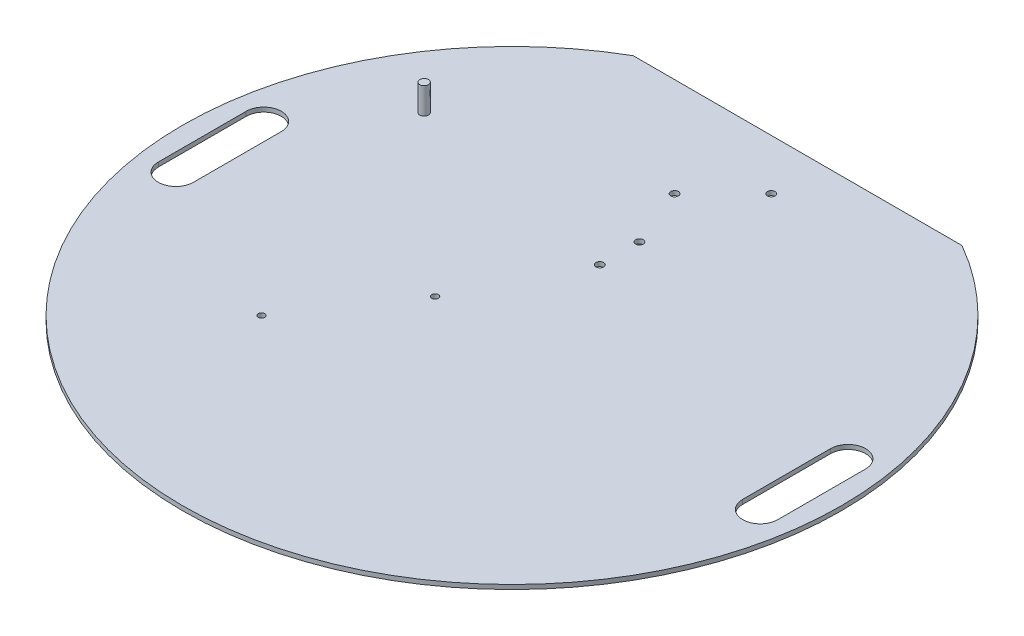
ISO-10303-21;
HEADER;
FILE_DESCRIPTION(('STEP AP214'),'2;1');
FILE_NAME('part.step','',(''),(''),'','','');
FILE_SCHEMA(('AUTOMOTIVE_DESIGN { 1 0 10303 214 1 1 1 1 }'));
ENDSEC;
DATA;
#1=APPLICATION_CONTEXT('core data for automotive mechanical design processes');
#2=APPLICATION_PROTOCOL_DEFINITION('international standard','automotive_design',2000,#1);
#3=PRODUCT_CONTEXT('',#1,'mechanical');
#4=PRODUCT('Part','Part','',(#3));
#5=PRODUCT_RELATED_PRODUCT_CATEGORY('part','',(#4));
#6=PRODUCT_DEFINITION_FORMATION('','',#4);
#7=PRODUCT_DEFINITION_CONTEXT('part definition',#1,'design');
#8=PRODUCT_DEFINITION('design','',#6,#7);
#9=PRODUCT_DEFINITION_SHAPE('','',#8);
#10=(LENGTH_UNIT() NAMED_UNIT(*) SI_UNIT(.MILLI.,.METRE.));
#11=(NAMED_UNIT(*) PLANE_ANGLE_UNIT() SI_UNIT($,.RADIAN.));
#12=(NAMED_UNIT(*) SI_UNIT($,.STERADIAN.) SOLID_ANGLE_UNIT());
#13=UNCERTAINTY_MEASURE_WITH_UNIT(LENGTH_MEASURE(1.E-05),#10,'distance_accuracy_value','');
#14=(GEOMETRIC_REPRESENTATION_CONTEXT(3) GLOBAL_UNCERTAINTY_ASSIGNED_CONTEXT((#13)) GLOBAL_UNIT_ASSIGNED_CONTEXT((#10,
#11,#12)) REPRESENTATION_CONTEXT('',''));
#15=CARTESIAN_POINT('',(0.,0.,0.));
#16=DIRECTION('',(0.,0.,1.));
#17=DIRECTION('',(1.,0.,0.));
#18=AXIS2_PLACEMENT_3D('',#15,#16,#17);
#19=CARTESIAN_POINT('',(0.,2.,0.));
#20=DIRECTION('',(0.,1.,0.));
#21=DIRECTION('',(0.,0.,1.));
#22=AXIS2_PLACEMENT_3D('',#19,#20,#21);
#23=PLANE('',#22);
#24=CARTESIAN_POINT('',(0.,2.,0.));
#25=DIRECTION('',(0.,1.,0.));
#26=DIRECTION('',(0.,0.,1.));
#27=AXIS2_PLACEMENT_3D('',#24,#25,#26);
#28=CIRCLE('',#27,150.);
#29=CARTESIAN_POINT('',(-74.8331477354789,2.,-130.));
#30=VERTEX_POINT('',#29);
#31=CARTESIAN_POINT('',(74.8331477354789,2.,-130.));
#32=VERTEX_POINT('',#31);
#33=EDGE_CURVE('E184',#30,#32,#28,.T.);
#34=ORIENTED_EDGE('',*,*,#33,.T.);
#35=DIRECTION('',(-1.,0.,0.));
#36=VECTOR('',#35,1.);
#37=CARTESIAN_POINT('',(-74.8331477354789,2.,-130.));
#38=LINE('',#37,#36);
#39=EDGE_CURVE('E187',#32,#30,#38,.T.);
#40=ORIENTED_EDGE('',*,*,#39,.T.);
#41=EDGE_LOOP('',(#34,#40));
#42=FACE_BOUND('',#41,.T.);
#43=CARTESIAN_POINT('',(-133.,2.,20.));
#44=DIRECTION('',(0.,-1.,0.));
#45=DIRECTION('',(0.,0.,-1.));
#46=AXIS2_PLACEMENT_3D('',#43,#44,#45);
#47=CIRCLE('',#46,7.99999999999998);
#48=CARTESIAN_POINT('',(-125.,2.,20.));
#49=VERTEX_POINT('',#48);
#50=CARTESIAN_POINT('',(-141.,2.,20.));
#51=VERTEX_POINT('',#50);
#52=EDGE_CURVE('E152',#49,#51,#47,.T.);
#53=ORIENTED_EDGE('',*,*,#52,.T.);
#54=DIRECTION('',(0.,0.,-1.));
#55=VECTOR('',#54,1.);
#56=CARTESIAN_POINT('',(-141.,2.,20.));
#57=LINE('',#56,#55);
#58=CARTESIAN_POINT('',(-141.,2.,-20.));
#59=VERTEX_POINT('',#58);
#60=EDGE_CURVE('E155',#51,#59,#57,.T.);
#61=ORIENTED_EDGE('',*,*,#60,.T.);
#62=CARTESIAN_POINT('',(-133.,2.,-20.));
#63=DIRECTION('',(0.,-1.,0.));
#64=DIRECTION('',(0.,0.,-1.));
#65=AXIS2_PLACEMENT_3D('',#62,#63,#64);
#66=CIRCLE('',#65,7.99999999999998);
#67=CARTESIAN_POINT('',(-125.,2.,-20.));
#68=VERTEX_POINT('',#67);
#69=EDGE_CURVE('E159',#59,#68,#66,.T.);
#70=ORIENTED_EDGE('',*,*,#69,.T.);
#71=DIRECTION('',(0.,0.,1.));
#72=VECTOR('',#71,1.);
#73=CARTESIAN_POINT('',(-125.,2.,20.));
#74=LINE('',#73,#72);
#75=EDGE_CURVE('E162',#68,#49,#74,.T.);
#76=ORIENTED_EDGE('',*,*,#75,.T.);
#77=EDGE_LOOP('',(#53,#61,#70,#76));
#78=FACE_BOUND('',#77,.T.);
#79=CARTESIAN_POINT('',(133.,2.,20.));
#80=DIRECTION('',(0.,-1.,0.));
#81=DIRECTION('',(0.,0.,-1.));
#82=AXIS2_PLACEMENT_3D('',#79,#80,#81);
#83=CIRCLE('',#82,8.00000000000001);
#84=CARTESIAN_POINT('',(141.,2.,20.));
#85=VERTEX_POINT('',#84);
#86=CARTESIAN_POINT('',(125.,2.,20.));
#87=VERTEX_POINT('',#86);
#88=EDGE_CURVE('E114',#85,#87,#83,.T.);
#89=ORIENTED_EDGE('',*,*,#88,.T.);
#90=DIRECTION('',(0.,0.,-1.));
#91=VECTOR('',#90,1.);
#92=CARTESIAN_POINT('',(125.,2.,20.));
#93=LINE('',#92,#91);
#94=CARTESIAN_POINT('',(125.,2.,-20.));
#95=VERTEX_POINT('',#94);
#96=EDGE_CURVE('E123',#87,#95,#93,.T.);
#97=ORIENTED_EDGE('',*,*,#96,.T.);
#98=CARTESIAN_POINT('',(133.,2.,-20.));
#99=DIRECTION('',(0.,-1.,0.));
#100=DIRECTION('',(0.,0.,-1.));
#101=AXIS2_PLACEMENT_3D('',#98,#99,#100);
#102=CIRCLE('',#101,8.00000000000001);
#103=CARTESIAN_POINT('',(141.,2.,-20.));
#104=VERTEX_POINT('',#103);
#105=EDGE_CURVE('E50',#95,#104,#102,.T.);
#106=ORIENTED_EDGE('',*,*,#105,.T.);
#107=DIRECTION('',(0.,0.,1.));
#108=VECTOR('',#107,1.);
#109=CARTESIAN_POINT('',(141.,2.,20.));
#110=LINE('',#109,#108);
#111=EDGE_CURVE('E120',#104,#85,#110,.T.);
#112=ORIENTED_EDGE('',*,*,#111,.T.);
#113=EDGE_LOOP('',(#89,#97,#106,#112));
#114=FACE_BOUND('',#113,.T.);
#115=CARTESIAN_POINT('',(-25.,2.,10.));
#116=DIRECTION('',(0.,-1.,0.));
#117=DIRECTION('',(0.,0.,-1.));
#118=AXIS2_PLACEMENT_3D('',#115,#116,#117);
#119=CIRCLE('',#118,1.50000000000001);
#120=CARTESIAN_POINT('',(-25.,2.,8.49999999999999));
#121=VERTEX_POINT('',#120);
#122=EDGE_CURVE('E142',#121,#121,#119,.T.);
#123=ORIENTED_EDGE('',*,*,#122,.T.);
#124=EDGE_LOOP('',(#123));
#125=FACE_BOUND('',#124,.T.);
#126=CARTESIAN_POINT('',(-57.,2.,57.));
#127=DIRECTION('',(0.,-1.,0.));
#128=DIRECTION('',(0.,0.,-1.));
#129=AXIS2_PLACEMENT_3D('',#126,#127,#128);
#130=CIRCLE('',#129,1.5);
#131=CARTESIAN_POINT('',(-57.,2.,55.5));
#132=VERTEX_POINT('',#131);
#133=EDGE_CURVE('E317',#132,#132,#130,.T.);
#134=ORIENTED_EDGE('',*,*,#133,.T.);
#135=EDGE_LOOP('',(#134));
#136=FACE_BOUND('',#135,.T.);
#137=CARTESIAN_POINT('',(0.,2.,-40.));
#138=DIRECTION('',(0.,-1.,0.));
#139=DIRECTION('',(0.,0.,-1.));
#140=AXIS2_PLACEMENT_3D('',#137,#138,#139);
#141=CIRCLE('',#140,1.75);
#142=CARTESIAN_POINT('',(0.,2.,-41.75));
#143=VERTEX_POINT('',#142);
#144=EDGE_CURVE('E311',#143,#143,#141,.T.);
#145=ORIENTED_EDGE('',*,*,#144,.T.);
#146=EDGE_LOOP('',(#145));
#147=FACE_BOUND('',#146,.T.);
#148=CARTESIAN_POINT('',(0.,2.,-58.));
#149=DIRECTION('',(0.,-1.,0.));
#150=DIRECTION('',(0.,0.,-1.));
#151=AXIS2_PLACEMENT_3D('',#148,#149,#150);
#152=CIRCLE('',#151,1.75);
#153=CARTESIAN_POINT('',(0.,2.,-59.75));
#154=VERTEX_POINT('',#153);
#155=EDGE_CURVE('E305',#154,#154,#152,.T.);
#156=ORIENTED_EDGE('',*,*,#155,.T.);
#157=EDGE_LOOP('',(#156));
#158=FACE_BOUND('',#157,.T.);
#159=CARTESIAN_POINT('',(11.,2.,-107.));
#160=DIRECTION('',(0.,-1.,0.));
#161=DIRECTION('',(0.,0.,-1.));
#162=AXIS2_PLACEMENT_3D('',#159,#160,#161);
#163=CIRCLE('',#162,1.75);
#164=CARTESIAN_POINT('',(11.,2.,-108.75));
#165=VERTEX_POINT('',#164);
#166=EDGE_CURVE('E299',#165,#165,#163,.T.);
#167=ORIENTED_EDGE('',*,*,#166,.T.);
#168=EDGE_LOOP('',(#167));
#169=FACE_BOUND('',#168,.T.);
#170=CARTESIAN_POINT('',(-11.,2.,-85.));
#171=DIRECTION('',(0.,-1.,0.));
#172=DIRECTION('',(0.,0.,-1.));
#173=AXIS2_PLACEMENT_3D('',#170,#171,#172);
#174=CIRCLE('',#173,1.75);
#175=CARTESIAN_POINT('',(-11.,2.,-86.75));
#176=VERTEX_POINT('',#175);
#177=EDGE_CURVE('E291',#176,#176,#174,.T.);
#178=ORIENTED_EDGE('',*,*,#177,.T.);
#179=EDGE_LOOP('',(#178));
#180=FACE_BOUND('',#179,.T.);
#181=CARTESIAN_POINT('',(-100.,2.,-60.));
#182=DIRECTION('',(0.,1.,0.));
#183=DIRECTION('',(0.,0.,1.));
#184=AXIS2_PLACEMENT_3D('',#181,#182,#183);
#185=CIRCLE('',#184,2.);
#186=CARTESIAN_POINT('',(-100.,2.,-58.));
#187=VERTEX_POINT('',#186);
#188=EDGE_CURVE('E288',#187,#187,#185,.T.);
#189=ORIENTED_EDGE('',*,*,#188,.F.);
#190=EDGE_LOOP('',(#189));
#191=FACE_BOUND('',#190,.T.);
#192=ADVANCED_FACE('F35',(#42,#78,#114,#125,#136,#147,#158,#169,#180,#191),#23,.T.);
#193=CARTESIAN_POINT('',(0.,2.,0.));
#194=DIRECTION('',(0.,-1.,0.));
#195=DIRECTION('',(0.,0.,-1.));
#196=AXIS2_PLACEMENT_3D('',#193,#194,#195);
#197=CYLINDRICAL_SURFACE('',#196,150.);
#198=CARTESIAN_POINT('',(0.,0.,0.));
#199=DIRECTION('',(0.,1.,0.));
#200=DIRECTION('',(0.,0.,1.));
#201=AXIS2_PLACEMENT_3D('',#198,#199,#200);
#202=CIRCLE('',#201,150.);
#203=CARTESIAN_POINT('',(-74.8331477354789,0.,-130.));
#204=VERTEX_POINT('',#203);
#205=CARTESIAN_POINT('',(74.8331477354789,0.,-130.));
#206=VERTEX_POINT('',#205);
#207=EDGE_CURVE('E177',#204,#206,#202,.T.);
#208=ORIENTED_EDGE('',*,*,#207,.T.);
#209=DIRECTION('',(0.,-1.,0.));
#210=VECTOR('',#209,1.);
#211=CARTESIAN_POINT('',(74.8331477354789,2.,-130.));
#212=LINE('',#211,#210);
#213=EDGE_CURVE('E11',#32,#206,#212,.T.);
#214=ORIENTED_EDGE('',*,*,#213,.F.);
#215=ORIENTED_EDGE('',*,*,#33,.F.);
#216=DIRECTION('',(0.,-1.,0.));
#217=VECTOR('',#216,1.);
#218=CARTESIAN_POINT('',(-74.8331477354789,2.,-130.));
#219=LINE('',#218,#217);
#220=EDGE_CURVE('E43',#30,#204,#219,.T.);
#221=ORIENTED_EDGE('',*,*,#220,.T.);
#222=EDGE_LOOP('',(#208,#214,#215,#221));
#223=FACE_BOUND('',#222,.T.);
#224=ADVANCED_FACE('F37',(#223),#197,.T.);
#225=CARTESIAN_POINT('',(-74.8331477354789,2.,-130.));
#226=DIRECTION('',(0.,0.,1.));
#227=DIRECTION('',(1.,0.,0.));
#228=AXIS2_PLACEMENT_3D('',#225,#226,#227);
#229=PLANE('',#228);
#230=DIRECTION('',(-1.,0.,0.));
#231=VECTOR('',#230,1.);
#232=CARTESIAN_POINT('',(-74.8331477354789,0.,-130.));
#233=LINE('',#232,#231);
#234=EDGE_CURVE('E188',#206,#204,#233,.T.);
#235=ORIENTED_EDGE('',*,*,#234,.T.);
#236=ORIENTED_EDGE('',*,*,#220,.F.);
#237=ORIENTED_EDGE('',*,*,#39,.F.);
#238=ORIENTED_EDGE('',*,*,#213,.T.);
#239=EDGE_LOOP('',(#235,#236,#237,#238));
#240=FACE_BOUND('',#239,.T.);
#241=ADVANCED_FACE('F201',(#240),#229,.F.);
#242=CARTESIAN_POINT('',(0.,0.,0.));
#243=DIRECTION('',(0.,1.,0.));
#244=DIRECTION('',(0.,0.,1.));
#245=AXIS2_PLACEMENT_3D('',#242,#243,#244);
#246=PLANE('',#245);
#247=CARTESIAN_POINT('',(-11.,0.,-85.));
#248=DIRECTION('',(0.,-1.,0.));
#249=DIRECTION('',(0.,0.,-1.));
#250=AXIS2_PLACEMENT_3D('',#247,#248,#249);
#251=CIRCLE('',#250,1.75);
#252=CARTESIAN_POINT('',(-11.,0.,-86.75));
#253=VERTEX_POINT('',#252);
#254=EDGE_CURVE('E287',#253,#253,#251,.T.);
#255=ORIENTED_EDGE('',*,*,#254,.F.);
#256=EDGE_LOOP('',(#255));
#257=FACE_BOUND('',#256,.T.);
#258=CARTESIAN_POINT('',(11.,0.,-107.));
#259=DIRECTION('',(0.,-1.,0.));
#260=DIRECTION('',(0.,0.,-1.));
#261=AXIS2_PLACEMENT_3D('',#258,#259,#260);
#262=CIRCLE('',#261,1.75);
#263=CARTESIAN_POINT('',(11.,0.,-108.75));
#264=VERTEX_POINT('',#263);
#265=EDGE_CURVE('E297',#264,#264,#262,.T.);
#266=ORIENTED_EDGE('',*,*,#265,.F.);
#267=EDGE_LOOP('',(#266));
#268=FACE_BOUND('',#267,.T.);
#269=CARTESIAN_POINT('',(0.,0.,-58.));
#270=DIRECTION('',(0.,-1.,0.));
#271=DIRECTION('',(0.,0.,-1.));
#272=AXIS2_PLACEMENT_3D('',#269,#270,#271);
#273=CIRCLE('',#272,1.75);
#274=CARTESIAN_POINT('',(0.,0.,-59.75));
#275=VERTEX_POINT('',#274);
#276=EDGE_CURVE('E302',#275,#275,#273,.T.);
#277=ORIENTED_EDGE('',*,*,#276,.F.);
#278=EDGE_LOOP('',(#277));
#279=FACE_BOUND('',#278,.T.);
#280=CARTESIAN_POINT('',(0.,0.,-40.));
#281=DIRECTION('',(0.,-1.,0.));
#282=DIRECTION('',(0.,0.,-1.));
#283=AXIS2_PLACEMENT_3D('',#280,#281,#282);
#284=CIRCLE('',#283,1.75);
#285=CARTESIAN_POINT('',(0.,0.,-41.75));
#286=VERTEX_POINT('',#285);
#287=EDGE_CURVE('E308',#286,#286,#284,.T.);
#288=ORIENTED_EDGE('',*,*,#287,.F.);
#289=EDGE_LOOP('',(#288));
#290=FACE_BOUND('',#289,.T.);
#291=CARTESIAN_POINT('',(-57.,0.,57.));
#292=DIRECTION('',(0.,-1.,0.));
#293=DIRECTION('',(0.,0.,-1.));
#294=AXIS2_PLACEMENT_3D('',#291,#292,#293);
#295=CIRCLE('',#294,1.5);
#296=CARTESIAN_POINT('',(-57.,0.,55.5));
#297=VERTEX_POINT('',#296);
#298=EDGE_CURVE('E314',#297,#297,#295,.T.);
#299=ORIENTED_EDGE('',*,*,#298,.F.);
#300=EDGE_LOOP('',(#299));
#301=FACE_BOUND('',#300,.T.);
#302=CARTESIAN_POINT('',(-25.,0.,10.));
#303=DIRECTION('',(0.,-1.,0.));
#304=DIRECTION('',(0.,0.,-1.));
#305=AXIS2_PLACEMENT_3D('',#302,#303,#304);
#306=CIRCLE('',#305,1.50000000000001);
#307=CARTESIAN_POINT('',(-25.,0.,8.49999999999999));
#308=VERTEX_POINT('',#307);
#309=EDGE_CURVE('E135',#308,#308,#306,.T.);
#310=ORIENTED_EDGE('',*,*,#309,.F.);
#311=EDGE_LOOP('',(#310));
#312=FACE_BOUND('',#311,.T.);
#313=DIRECTION('',(0.,0.,-1.));
#314=VECTOR('',#313,1.);
#315=CARTESIAN_POINT('',(125.,0.,20.));
#316=LINE('',#315,#314);
#317=CARTESIAN_POINT('',(125.,0.,20.));
#318=VERTEX_POINT('',#317);
#319=CARTESIAN_POINT('',(125.,0.,-20.));
#320=VERTEX_POINT('',#319);
#321=EDGE_CURVE('E141',#318,#320,#316,.T.);
#322=ORIENTED_EDGE('',*,*,#321,.F.);
#323=CARTESIAN_POINT('',(133.,0.,20.));
#324=DIRECTION('',(0.,-1.,0.));
#325=DIRECTION('',(0.,0.,-1.));
#326=AXIS2_PLACEMENT_3D('',#323,#324,#325);
#327=CIRCLE('',#326,8.00000000000001);
#328=CARTESIAN_POINT('',(141.,0.,20.));
#329=VERTEX_POINT('',#328);
#330=EDGE_CURVE('E58',#329,#318,#327,.T.);
#331=ORIENTED_EDGE('',*,*,#330,.F.);
#332=DIRECTION('',(0.,0.,1.));
#333=VECTOR('',#332,1.);
#334=CARTESIAN_POINT('',(141.,0.,20.));
#335=LINE('',#334,#333);
#336=CARTESIAN_POINT('',(141.,0.,-20.));
#337=VERTEX_POINT('',#336);
#338=EDGE_CURVE('E129',#337,#329,#335,.T.);
#339=ORIENTED_EDGE('',*,*,#338,.F.);
#340=CARTESIAN_POINT('',(133.,0.,-20.));
#341=DIRECTION('',(0.,-1.,0.));
#342=DIRECTION('',(0.,0.,-1.));
#343=AXIS2_PLACEMENT_3D('',#340,#341,#342);
#344=CIRCLE('',#343,8.00000000000001);
#345=EDGE_CURVE('E132',#320,#337,#344,.T.);
#346=ORIENTED_EDGE('',*,*,#345,.F.);
#347=EDGE_LOOP('',(#322,#331,#339,#346));
#348=FACE_BOUND('',#347,.T.);
#349=DIRECTION('',(0.,0.,-1.));
#350=VECTOR('',#349,1.);
#351=CARTESIAN_POINT('',(-141.,0.,20.));
#352=LINE('',#351,#350);
#353=CARTESIAN_POINT('',(-141.,0.,20.));
#354=VERTEX_POINT('',#353);
#355=CARTESIAN_POINT('',(-141.,0.,-20.));
#356=VERTEX_POINT('',#355);
#357=EDGE_CURVE('E167',#354,#356,#352,.T.);
#358=ORIENTED_EDGE('',*,*,#357,.F.);
#359=CARTESIAN_POINT('',(-133.,0.,20.));
#360=DIRECTION('',(0.,-1.,0.));
#361=DIRECTION('',(0.,0.,-1.));
#362=AXIS2_PLACEMENT_3D('',#359,#360,#361);
#363=CIRCLE('',#362,7.99999999999998);
#364=CARTESIAN_POINT('',(-125.,0.,20.));
#365=VERTEX_POINT('',#364);
#366=EDGE_CURVE('E148',#365,#354,#363,.T.);
#367=ORIENTED_EDGE('',*,*,#366,.F.);
#368=DIRECTION('',(0.,0.,1.));
#369=VECTOR('',#368,1.);
#370=CARTESIAN_POINT('',(-125.,0.,20.));
#371=LINE('',#370,#369);
#372=CARTESIAN_POINT('',(-125.,0.,-20.));
#373=VERTEX_POINT('',#372);
#374=EDGE_CURVE('E156',#373,#365,#371,.T.);
#375=ORIENTED_EDGE('',*,*,#374,.F.);
#376=CARTESIAN_POINT('',(-133.,0.,-20.));
#377=DIRECTION('',(0.,-1.,0.));
#378=DIRECTION('',(0.,0.,-1.));
#379=AXIS2_PLACEMENT_3D('',#376,#377,#378);
#380=CIRCLE('',#379,7.99999999999998);
#381=EDGE_CURVE('E170',#356,#373,#380,.T.);
#382=ORIENTED_EDGE('',*,*,#381,.F.);
#383=EDGE_LOOP('',(#358,#367,#375,#382));
#384=FACE_BOUND('',#383,.T.);
#385=ORIENTED_EDGE('',*,*,#207,.F.);
#386=ORIENTED_EDGE('',*,*,#234,.F.);
#387=EDGE_LOOP('',(#385,#386));
#388=FACE_BOUND('',#387,.T.);
#389=ADVANCED_FACE('F200',(#257,#268,#279,#290,#301,#312,#348,#384,#388),#246,.F.);
#390=CARTESIAN_POINT('',(-133.,2.,20.));
#391=DIRECTION('',(0.,-1.,0.));
#392=DIRECTION('',(0.,0.,-1.));
#393=AXIS2_PLACEMENT_3D('',#390,#391,#392);
#394=CYLINDRICAL_SURFACE('',#393,7.99999999999998);
#395=ORIENTED_EDGE('',*,*,#366,.T.);
#396=DIRECTION('',(0.,-1.,0.));
#397=VECTOR('',#396,1.);
#398=CARTESIAN_POINT('',(-141.,2.,20.));
#399=LINE('',#398,#397);
#400=EDGE_CURVE('E165',#51,#354,#399,.T.);
#401=ORIENTED_EDGE('',*,*,#400,.F.);
#402=ORIENTED_EDGE('',*,*,#52,.F.);
#403=DIRECTION('',(0.,-1.,0.));
#404=VECTOR('',#403,1.);
#405=CARTESIAN_POINT('',(-125.,2.,20.));
#406=LINE('',#405,#404);
#407=EDGE_CURVE('E175',#49,#365,#406,.T.);
#408=ORIENTED_EDGE('',*,*,#407,.T.);
#409=EDGE_LOOP('',(#395,#401,#402,#408));
#410=FACE_BOUND('',#409,.T.);
#411=ADVANCED_FACE('F210',(#410),#394,.F.);
#412=CARTESIAN_POINT('',(-125.,2.,20.));
#413=DIRECTION('',(1.,0.,0.));
#414=DIRECTION('',(0.,0.,-1.));
#415=AXIS2_PLACEMENT_3D('',#412,#413,#414);
#416=PLANE('',#415);
#417=ORIENTED_EDGE('',*,*,#374,.T.);
#418=ORIENTED_EDGE('',*,*,#407,.F.);
#419=ORIENTED_EDGE('',*,*,#75,.F.);
#420=DIRECTION('',(0.,-1.,0.));
#421=VECTOR('',#420,1.);
#422=CARTESIAN_POINT('',(-125.,2.,-20.));
#423=LINE('',#422,#421);
#424=EDGE_CURVE('E178',#68,#373,#423,.T.);
#425=ORIENTED_EDGE('',*,*,#424,.T.);
#426=EDGE_LOOP('',(#417,#418,#419,#425));
#427=FACE_BOUND('',#426,.T.);
#428=ADVANCED_FACE('F221',(#427),#416,.F.);
#429=CARTESIAN_POINT('',(-133.,2.,-20.));
#430=DIRECTION('',(0.,-1.,0.));
#431=DIRECTION('',(0.,0.,-1.));
#432=AXIS2_PLACEMENT_3D('',#429,#430,#431);
#433=CYLINDRICAL_SURFACE('',#432,7.99999999999998);
#434=ORIENTED_EDGE('',*,*,#381,.T.);
#435=ORIENTED_EDGE('',*,*,#424,.F.);
#436=ORIENTED_EDGE('',*,*,#69,.F.);
#437=DIRECTION('',(0.,-1.,0.));
#438=VECTOR('',#437,1.);
#439=CARTESIAN_POINT('',(-141.,2.,-20.));
#440=LINE('',#439,#438);
#441=EDGE_CURVE('E180',#59,#356,#440,.T.);
#442=ORIENTED_EDGE('',*,*,#441,.T.);
#443=EDGE_LOOP('',(#434,#435,#436,#442));
#444=FACE_BOUND('',#443,.T.);
#445=ADVANCED_FACE('F218',(#444),#433,.F.);
#446=CARTESIAN_POINT('',(-141.,2.,20.));
#447=DIRECTION('',(-1.,0.,0.));
#448=DIRECTION('',(0.,0.,1.));
#449=AXIS2_PLACEMENT_3D('',#446,#447,#448);
#450=PLANE('',#449);
#451=ORIENTED_EDGE('',*,*,#357,.T.);
#452=ORIENTED_EDGE('',*,*,#441,.F.);
#453=ORIENTED_EDGE('',*,*,#60,.F.);
#454=ORIENTED_EDGE('',*,*,#400,.T.);
#455=EDGE_LOOP('',(#451,#452,#453,#454));
#456=FACE_BOUND('',#455,.T.);
#457=ADVANCED_FACE('F215',(#456),#450,.F.);
#458=CARTESIAN_POINT('',(133.,2.,20.));
#459=DIRECTION('',(0.,-1.,0.));
#460=DIRECTION('',(0.,0.,-1.));
#461=AXIS2_PLACEMENT_3D('',#458,#459,#460);
#462=CYLINDRICAL_SURFACE('',#461,8.00000000000001);
#463=ORIENTED_EDGE('',*,*,#330,.T.);
#464=DIRECTION('',(0.,-1.,0.));
#465=VECTOR('',#464,1.);
#466=CARTESIAN_POINT('',(125.,2.,20.));
#467=LINE('',#466,#465);
#468=EDGE_CURVE('E110',#87,#318,#467,.T.);
#469=ORIENTED_EDGE('',*,*,#468,.F.);
#470=ORIENTED_EDGE('',*,*,#88,.F.);
#471=DIRECTION('',(0.,-1.,0.));
#472=VECTOR('',#471,1.);
#473=CARTESIAN_POINT('',(141.,2.,20.));
#474=LINE('',#473,#472);
#475=EDGE_CURVE('E146',#85,#329,#474,.T.);
#476=ORIENTED_EDGE('',*,*,#475,.T.);
#477=EDGE_LOOP('',(#463,#469,#470,#476));
#478=FACE_BOUND('',#477,.T.);
#479=ADVANCED_FACE('F112',(#478),#462,.F.);
#480=CARTESIAN_POINT('',(141.,2.,20.));
#481=DIRECTION('',(1.,0.,0.));
#482=DIRECTION('',(0.,0.,-1.));
#483=AXIS2_PLACEMENT_3D('',#480,#481,#482);
#484=PLANE('',#483);
#485=ORIENTED_EDGE('',*,*,#338,.T.);
#486=ORIENTED_EDGE('',*,*,#475,.F.);
#487=ORIENTED_EDGE('',*,*,#111,.F.);
#488=DIRECTION('',(0.,-1.,0.));
#489=VECTOR('',#488,1.);
#490=CARTESIAN_POINT('',(141.,2.,-20.));
#491=LINE('',#490,#489);
#492=EDGE_CURVE('E149',#104,#337,#491,.T.);
#493=ORIENTED_EDGE('',*,*,#492,.T.);
#494=EDGE_LOOP('',(#485,#486,#487,#493));
#495=FACE_BOUND('',#494,.T.);
#496=ADVANCED_FACE('F242',(#495),#484,.F.);
#497=CARTESIAN_POINT('',(133.,2.,-20.));
#498=DIRECTION('',(0.,-1.,0.));
#499=DIRECTION('',(0.,0.,-1.));
#500=AXIS2_PLACEMENT_3D('',#497,#498,#499);
#501=CYLINDRICAL_SURFACE('',#500,8.00000000000001);
#502=ORIENTED_EDGE('',*,*,#345,.T.);
#503=ORIENTED_EDGE('',*,*,#492,.F.);
#504=ORIENTED_EDGE('',*,*,#105,.F.);
#505=DIRECTION('',(0.,-1.,0.));
#506=VECTOR('',#505,1.);
#507=CARTESIAN_POINT('',(125.,2.,-20.));
#508=LINE('',#507,#506);
#509=EDGE_CURVE('E119',#95,#320,#508,.T.);
#510=ORIENTED_EDGE('',*,*,#509,.T.);
#511=EDGE_LOOP('',(#502,#503,#504,#510));
#512=FACE_BOUND('',#511,.T.);
#513=ADVANCED_FACE('F246',(#512),#501,.F.);
#514=CARTESIAN_POINT('',(125.,2.,20.));
#515=DIRECTION('',(-1.,0.,0.));
#516=DIRECTION('',(0.,0.,1.));
#517=AXIS2_PLACEMENT_3D('',#514,#515,#516);
#518=PLANE('',#517);
#519=ORIENTED_EDGE('',*,*,#321,.T.);
#520=ORIENTED_EDGE('',*,*,#509,.F.);
#521=ORIENTED_EDGE('',*,*,#96,.F.);
#522=ORIENTED_EDGE('',*,*,#468,.T.);
#523=EDGE_LOOP('',(#519,#520,#521,#522));
#524=FACE_BOUND('',#523,.T.);
#525=ADVANCED_FACE('F124',(#524),#518,.F.);
#526=CARTESIAN_POINT('',(-25.,2.,10.));
#527=DIRECTION('',(0.,-1.,0.));
#528=DIRECTION('',(0.,0.,-1.));
#529=AXIS2_PLACEMENT_3D('',#526,#527,#528);
#530=CYLINDRICAL_SURFACE('',#529,1.50000000000001);
#531=ORIENTED_EDGE('',*,*,#122,.F.);
#532=EDGE_LOOP('',(#531));
#533=FACE_BOUND('',#532,.T.);
#534=ORIENTED_EDGE('',*,*,#309,.T.);
#535=EDGE_LOOP('',(#534));
#536=FACE_BOUND('',#535,.T.);
#537=ADVANCED_FACE('F245',(#533,#536),#530,.F.);
#538=CARTESIAN_POINT('',(-57.,2.,57.));
#539=DIRECTION('',(0.,-1.,0.));
#540=DIRECTION('',(0.,0.,-1.));
#541=AXIS2_PLACEMENT_3D('',#538,#539,#540);
#542=CYLINDRICAL_SURFACE('',#541,1.5);
#543=ORIENTED_EDGE('',*,*,#133,.F.);
#544=EDGE_LOOP('',(#543));
#545=FACE_BOUND('',#544,.T.);
#546=ORIENTED_EDGE('',*,*,#298,.T.);
#547=EDGE_LOOP('',(#546));
#548=FACE_BOUND('',#547,.T.);
#549=ADVANCED_FACE('F254',(#545,#548),#542,.F.);
#550=CARTESIAN_POINT('',(0.,2.,-40.));
#551=DIRECTION('',(0.,-1.,0.));
#552=DIRECTION('',(0.,0.,-1.));
#553=AXIS2_PLACEMENT_3D('',#550,#551,#552);
#554=CYLINDRICAL_SURFACE('',#553,1.75);
#555=ORIENTED_EDGE('',*,*,#144,.F.);
#556=EDGE_LOOP('',(#555));
#557=FACE_BOUND('',#556,.T.);
#558=ORIENTED_EDGE('',*,*,#287,.T.);
#559=EDGE_LOOP('',(#558));
#560=FACE_BOUND('',#559,.T.);
#561=ADVANCED_FACE('F258',(#557,#560),#554,.F.);
#562=CARTESIAN_POINT('',(0.,2.,-58.));
#563=DIRECTION('',(0.,-1.,0.));
#564=DIRECTION('',(0.,0.,-1.));
#565=AXIS2_PLACEMENT_3D('',#562,#563,#564);
#566=CYLINDRICAL_SURFACE('',#565,1.75);
#567=ORIENTED_EDGE('',*,*,#155,.F.);
#568=EDGE_LOOP('',(#567));
#569=FACE_BOUND('',#568,.T.);
#570=ORIENTED_EDGE('',*,*,#276,.T.);
#571=EDGE_LOOP('',(#570));
#572=FACE_BOUND('',#571,.T.);
#573=ADVANCED_FACE('F262',(#569,#572),#566,.F.);
#574=CARTESIAN_POINT('',(11.,2.,-107.));
#575=DIRECTION('',(0.,-1.,0.));
#576=DIRECTION('',(0.,0.,-1.));
#577=AXIS2_PLACEMENT_3D('',#574,#575,#576);
#578=CYLINDRICAL_SURFACE('',#577,1.75);
#579=ORIENTED_EDGE('',*,*,#166,.F.);
#580=EDGE_LOOP('',(#579));
#581=FACE_BOUND('',#580,.T.);
#582=ORIENTED_EDGE('',*,*,#265,.T.);
#583=EDGE_LOOP('',(#582));
#584=FACE_BOUND('',#583,.T.);
#585=ADVANCED_FACE('F266',(#581,#584),#578,.F.);
#586=CARTESIAN_POINT('',(-11.,2.,-85.));
#587=DIRECTION('',(0.,-1.,0.));
#588=DIRECTION('',(0.,0.,-1.));
#589=AXIS2_PLACEMENT_3D('',#586,#587,#588);
#590=CYLINDRICAL_SURFACE('',#589,1.75);
#591=ORIENTED_EDGE('',*,*,#177,.F.);
#592=EDGE_LOOP('',(#591));
#593=FACE_BOUND('',#592,.T.);
#594=ORIENTED_EDGE('',*,*,#254,.T.);
#595=EDGE_LOOP('',(#594));
#596=FACE_BOUND('',#595,.T.);
#597=ADVANCED_FACE('F270',(#593,#596),#590,.F.);
#598=CARTESIAN_POINT('',(-100.,14.,-60.));
#599=DIRECTION('',(0.,-1.,0.));
#600=DIRECTION('',(0.,0.,-1.));
#601=AXIS2_PLACEMENT_3D('',#598,#599,#600);
#602=CYLINDRICAL_SURFACE('',#601,2.);
#603=CARTESIAN_POINT('',(-100.,14.,-60.));
#604=DIRECTION('',(0.,1.,0.));
#605=DIRECTION('',(0.,0.,1.));
#606=AXIS2_PLACEMENT_3D('',#603,#604,#605);
#607=CIRCLE('',#606,2.);
#608=CARTESIAN_POINT('',(-100.,14.,-58.));
#609=VERTEX_POINT('',#608);
#610=EDGE_CURVE('E286',#609,#609,#607,.T.);
#611=ORIENTED_EDGE('',*,*,#610,.F.);
#612=EDGE_LOOP('',(#611));
#613=FACE_BOUND('',#612,.T.);
#614=ORIENTED_EDGE('',*,*,#188,.T.);
#615=EDGE_LOOP('',(#614));
#616=FACE_BOUND('',#615,.T.);
#617=ADVANCED_FACE('F274',(#613,#616),#602,.T.);
#618=CARTESIAN_POINT('',(-100.,14.,-60.));
#619=DIRECTION('',(0.,1.,0.));
#620=DIRECTION('',(0.,0.,1.));
#621=AXIS2_PLACEMENT_3D('',#618,#619,#620);
#622=PLANE('',#621);
#623=ORIENTED_EDGE('',*,*,#610,.T.);
#624=EDGE_LOOP('',(#623));
#625=FACE_BOUND('',#624,.T.);
#626=ADVANCED_FACE('F278',(#625),#622,.T.);
#627=CLOSED_SHELL('',(#192,#224,#241,#389,#411,#428,#445,#457,#479,#496,#513,#525,#537,#549,
#561,#573,#585,#597,#617,#626));
#628=MANIFOLD_SOLID_BREP('B2',#627);
#629=ADVANCED_BREP_SHAPE_REPRESENTATION('',(#18,#628),#14);
#630=SHAPE_DEFINITION_REPRESENTATION(#9,#629);
ENDSEC;
END-ISO-10303-21;
